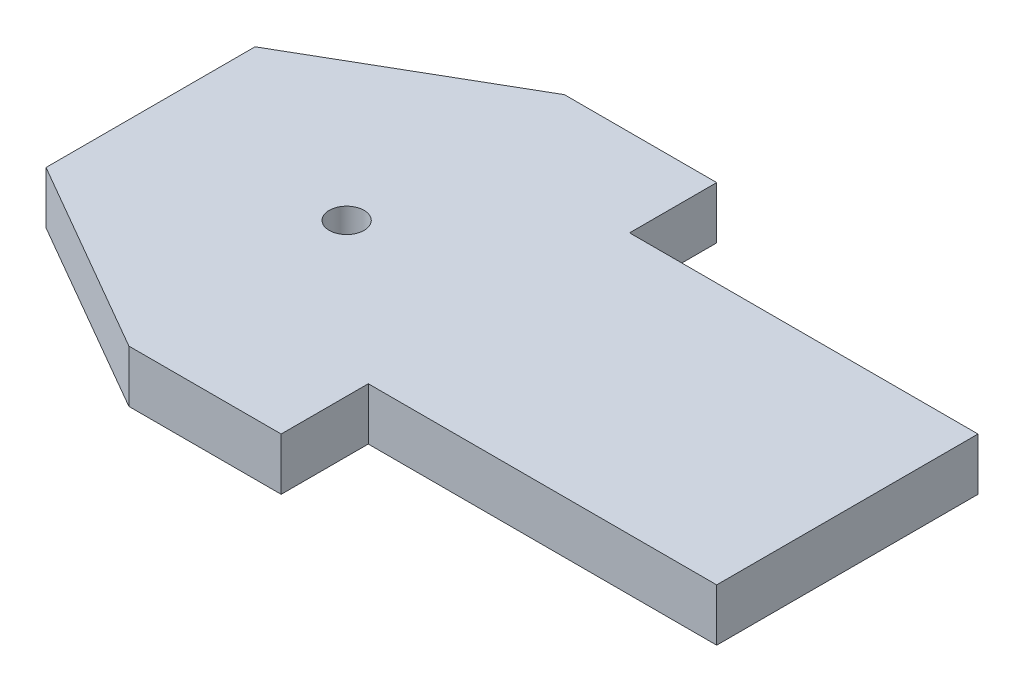
ISO-10303-21;
HEADER;
FILE_DESCRIPTION(('STEP AP214'),'2;1');
FILE_NAME('part.step','',(''),(''),'','','');
FILE_SCHEMA(('AUTOMOTIVE_DESIGN { 1 0 10303 214 1 1 1 1 }'));
ENDSEC;
DATA;
#1=APPLICATION_CONTEXT('core data for automotive mechanical design processes');
#2=APPLICATION_PROTOCOL_DEFINITION('international standard','automotive_design',2000,#1);
#3=PRODUCT_CONTEXT('',#1,'mechanical');
#4=PRODUCT('Part','Part','',(#3));
#5=PRODUCT_RELATED_PRODUCT_CATEGORY('part','',(#4));
#6=PRODUCT_DEFINITION_FORMATION('','',#4);
#7=PRODUCT_DEFINITION_CONTEXT('part definition',#1,'design');
#8=PRODUCT_DEFINITION('design','',#6,#7);
#9=PRODUCT_DEFINITION_SHAPE('','',#8);
#10=(LENGTH_UNIT() NAMED_UNIT(*) SI_UNIT(.MILLI.,.METRE.));
#11=(NAMED_UNIT(*) PLANE_ANGLE_UNIT() SI_UNIT($,.RADIAN.));
#12=(NAMED_UNIT(*) SI_UNIT($,.STERADIAN.) SOLID_ANGLE_UNIT());
#13=UNCERTAINTY_MEASURE_WITH_UNIT(LENGTH_MEASURE(1.E-05),#10,'distance_accuracy_value','');
#14=(GEOMETRIC_REPRESENTATION_CONTEXT(3) GLOBAL_UNCERTAINTY_ASSIGNED_CONTEXT((#13)) GLOBAL_UNIT_ASSIGNED_CONTEXT((#10,
#11,#12)) REPRESENTATION_CONTEXT('',''));
#15=CARTESIAN_POINT('',(0.,0.,0.));
#16=DIRECTION('',(0.,0.,1.));
#17=DIRECTION('',(1.,0.,0.));
#18=AXIS2_PLACEMENT_3D('',#15,#16,#17);
#19=CARTESIAN_POINT('',(10.0000000000004,3.,-7.50000000000014));
#20=DIRECTION('',(-1.,0.,0.));
#21=DIRECTION('',(0.,0.,1.));
#22=AXIS2_PLACEMENT_3D('',#19,#20,#21);
#23=PLANE('',#22);
#24=DIRECTION('',(0.,0.,-1.));
#25=VECTOR('',#24,1.);
#26=CARTESIAN_POINT('',(10.0000000000004,0.,-7.50000000000014));
#27=LINE('',#26,#25);
#28=CARTESIAN_POINT('',(10.,0.,7.5));
#29=VERTEX_POINT('',#28);
#30=CARTESIAN_POINT('',(10.0000000000004,0.,-7.50000000000014));
#31=VERTEX_POINT('',#30);
#32=EDGE_CURVE('E146',#29,#31,#27,.T.);
#33=ORIENTED_EDGE('',*,*,#32,.T.);
#34=DIRECTION('',(0.,-1.,0.));
#35=VECTOR('',#34,1.);
#36=CARTESIAN_POINT('',(10.0000000000004,3.,-7.50000000000014));
#37=LINE('',#36,#35);
#38=CARTESIAN_POINT('',(10.0000000000004,3.,-7.50000000000014));
#39=VERTEX_POINT('',#38);
#40=EDGE_CURVE('E11',#39,#31,#37,.T.);
#41=ORIENTED_EDGE('',*,*,#40,.F.);
#42=DIRECTION('',(0.,0.,-1.));
#43=VECTOR('',#42,1.);
#44=CARTESIAN_POINT('',(10.0000000000004,3.,-7.50000000000014));
#45=LINE('',#44,#43);
#46=CARTESIAN_POINT('',(10.,3.,7.5));
#47=VERTEX_POINT('',#46);
#48=EDGE_CURVE('E164',#47,#39,#45,.T.);
#49=ORIENTED_EDGE('',*,*,#48,.F.);
#50=DIRECTION('',(0.,-1.,0.));
#51=VECTOR('',#50,1.);
#52=CARTESIAN_POINT('',(10.,3.,7.5));
#53=LINE('',#52,#51);
#54=EDGE_CURVE('E142',#47,#29,#53,.T.);
#55=ORIENTED_EDGE('',*,*,#54,.T.);
#56=EDGE_LOOP('',(#33,#41,#49,#55));
#57=FACE_BOUND('',#56,.T.);
#58=ADVANCED_FACE('F37',(#57),#23,.F.);
#59=CARTESIAN_POINT('',(-10.0000000000007,3.,-7.50000000000014));
#60=DIRECTION('',(0.,0.,1.));
#61=DIRECTION('',(1.,0.,0.));
#62=AXIS2_PLACEMENT_3D('',#59,#60,#61);
#63=PLANE('',#62);
#64=DIRECTION('',(-1.,0.,0.));
#65=VECTOR('',#64,1.);
#66=CARTESIAN_POINT('',(-10.0000000000007,0.,-7.50000000000014));
#67=LINE('',#66,#65);
#68=CARTESIAN_POINT('',(-10.0000000000007,0.,-7.50000000000014));
#69=VERTEX_POINT('',#68);
#70=EDGE_CURVE('E149',#31,#69,#67,.T.);
#71=ORIENTED_EDGE('',*,*,#70,.T.);
#72=DIRECTION('',(0.,-1.,0.));
#73=VECTOR('',#72,1.);
#74=CARTESIAN_POINT('',(-10.0000000000007,3.,-7.50000000000014));
#75=LINE('',#74,#73);
#76=CARTESIAN_POINT('',(-10.0000000000007,3.,-7.50000000000014));
#77=VERTEX_POINT('',#76);
#78=EDGE_CURVE('E46',#77,#69,#75,.T.);
#79=ORIENTED_EDGE('',*,*,#78,.F.);
#80=DIRECTION('',(-1.,0.,0.));
#81=VECTOR('',#80,1.);
#82=CARTESIAN_POINT('',(-10.0000000000007,3.,-7.50000000000014));
#83=LINE('',#82,#81);
#84=EDGE_CURVE('E103',#39,#77,#83,.T.);
#85=ORIENTED_EDGE('',*,*,#84,.F.);
#86=ORIENTED_EDGE('',*,*,#40,.T.);
#87=EDGE_LOOP('',(#71,#79,#85,#86));
#88=FACE_BOUND('',#87,.T.);
#89=ADVANCED_FACE('F229',(#88),#63,.F.);
#90=CARTESIAN_POINT('',(-10.0000000000007,3.,-7.50000000000014));
#91=DIRECTION('',(-1.,0.,0.));
#92=DIRECTION('',(0.,0.,1.));
#93=AXIS2_PLACEMENT_3D('',#90,#91,#92);
#94=PLANE('',#93);
#95=DIRECTION('',(0.,0.,-1.));
#96=VECTOR('',#95,1.);
#97=CARTESIAN_POINT('',(-10.0000000000007,0.,-7.50000000000014));
#98=LINE('',#97,#96);
#99=CARTESIAN_POINT('',(-10.0000000000007,0.,-12.5000000000001));
#100=VERTEX_POINT('',#99);
#101=EDGE_CURVE('E151',#69,#100,#98,.T.);
#102=ORIENTED_EDGE('',*,*,#101,.T.);
#103=DIRECTION('',(0.,-1.,0.));
#104=VECTOR('',#103,1.);
#105=CARTESIAN_POINT('',(-10.0000000000007,3.,-12.5000000000001));
#106=LINE('',#105,#104);
#107=CARTESIAN_POINT('',(-10.0000000000007,3.,-12.5000000000001));
#108=VERTEX_POINT('',#107);
#109=EDGE_CURVE('E177',#108,#100,#106,.T.);
#110=ORIENTED_EDGE('',*,*,#109,.F.);
#111=DIRECTION('',(0.,0.,-1.));
#112=VECTOR('',#111,1.);
#113=CARTESIAN_POINT('',(-10.0000000000007,3.,-7.50000000000014));
#114=LINE('',#113,#112);
#115=EDGE_CURVE('E186',#77,#108,#114,.T.);
#116=ORIENTED_EDGE('',*,*,#115,.F.);
#117=ORIENTED_EDGE('',*,*,#78,.T.);
#118=EDGE_LOOP('',(#102,#110,#116,#117));
#119=FACE_BOUND('',#118,.T.);
#120=ADVANCED_FACE('F184',(#119),#94,.F.);
#121=CARTESIAN_POINT('',(-10.0000000000007,3.,-12.5000000000001));
#122=DIRECTION('',(0.,0.,1.));
#123=DIRECTION('',(1.,0.,0.));
#124=AXIS2_PLACEMENT_3D('',#121,#122,#123);
#125=PLANE('',#124);
#126=DIRECTION('',(-1.,0.,0.));
#127=VECTOR('',#126,1.);
#128=CARTESIAN_POINT('',(-10.0000000000007,0.,-12.5000000000001));
#129=LINE('',#128,#127);
#130=CARTESIAN_POINT('',(-18.7416697508023,0.,-12.5000000000001));
#131=VERTEX_POINT('',#130);
#132=EDGE_CURVE('E153',#100,#131,#129,.T.);
#133=ORIENTED_EDGE('',*,*,#132,.T.);
#134=DIRECTION('',(0.,-1.,0.));
#135=VECTOR('',#134,1.);
#136=CARTESIAN_POINT('',(-18.7416697508023,3.,-12.5000000000001));
#137=LINE('',#136,#135);
#138=CARTESIAN_POINT('',(-18.7416697508023,3.,-12.5000000000001));
#139=VERTEX_POINT('',#138);
#140=EDGE_CURVE('E174',#139,#131,#137,.T.);
#141=ORIENTED_EDGE('',*,*,#140,.F.);
#142=DIRECTION('',(-1.,0.,0.));
#143=VECTOR('',#142,1.);
#144=CARTESIAN_POINT('',(-10.0000000000007,3.,-12.5000000000001));
#145=LINE('',#144,#143);
#146=EDGE_CURVE('E204',#108,#139,#145,.T.);
#147=ORIENTED_EDGE('',*,*,#146,.F.);
#148=ORIENTED_EDGE('',*,*,#109,.T.);
#149=EDGE_LOOP('',(#133,#141,#147,#148));
#150=FACE_BOUND('',#149,.T.);
#151=ADVANCED_FACE('F195',(#150),#125,.F.);
#152=CARTESIAN_POINT('',(-30.0000000000001,3.,-6.0000000000002));
#153=DIRECTION('',(0.499999999999995,0.,0.866025403784441));
#154=DIRECTION('',(0.866025403784442,0.,-0.499999999999995));
#155=AXIS2_PLACEMENT_3D('',#152,#153,#154);
#156=PLANE('',#155);
#157=DIRECTION('',(-0.866025403784442,0.,0.499999999999995));
#158=VECTOR('',#157,1.);
#159=CARTESIAN_POINT('',(-30.0000000000001,0.,-6.0000000000002));
#160=LINE('',#159,#158);
#161=CARTESIAN_POINT('',(-30.0000000000001,0.,-6.0000000000002));
#162=VERTEX_POINT('',#161);
#163=EDGE_CURVE('E155',#131,#162,#160,.T.);
#164=ORIENTED_EDGE('',*,*,#163,.T.);
#165=DIRECTION('',(0.,-1.,0.));
#166=VECTOR('',#165,1.);
#167=CARTESIAN_POINT('',(-30.0000000000001,3.,-6.0000000000002));
#168=LINE('',#167,#166);
#169=CARTESIAN_POINT('',(-30.0000000000001,3.,-6.0000000000002));
#170=VERTEX_POINT('',#169);
#171=EDGE_CURVE('E171',#170,#162,#168,.T.);
#172=ORIENTED_EDGE('',*,*,#171,.F.);
#173=DIRECTION('',(-0.866025403784442,0.,0.499999999999995));
#174=VECTOR('',#173,1.);
#175=CARTESIAN_POINT('',(-30.0000000000001,3.,-6.0000000000002));
#176=LINE('',#175,#174);
#177=EDGE_CURVE('E201',#139,#170,#176,.T.);
#178=ORIENTED_EDGE('',*,*,#177,.F.);
#179=ORIENTED_EDGE('',*,*,#140,.T.);
#180=EDGE_LOOP('',(#164,#172,#178,#179));
#181=FACE_BOUND('',#180,.T.);
#182=ADVANCED_FACE('F199',(#181),#156,.F.);
#183=CARTESIAN_POINT('',(-30.0000000000001,3.,-6.0000000000002));
#184=DIRECTION('',(1.,0.,0.));
#185=DIRECTION('',(0.,0.,-1.));
#186=AXIS2_PLACEMENT_3D('',#183,#184,#185);
#187=PLANE('',#186);
#188=DIRECTION('',(0.,0.,1.));
#189=VECTOR('',#188,1.);
#190=CARTESIAN_POINT('',(-30.0000000000001,0.,-6.0000000000002));
#191=LINE('',#190,#189);
#192=CARTESIAN_POINT('',(-30.0000000000001,0.,5.9999999999998));
#193=VERTEX_POINT('',#192);
#194=EDGE_CURVE('E157',#162,#193,#191,.T.);
#195=ORIENTED_EDGE('',*,*,#194,.T.);
#196=DIRECTION('',(0.,-1.,0.));
#197=VECTOR('',#196,1.);
#198=CARTESIAN_POINT('',(-30.0000000000001,3.,5.9999999999998));
#199=LINE('',#198,#197);
#200=CARTESIAN_POINT('',(-30.0000000000001,3.,5.9999999999998));
#201=VERTEX_POINT('',#200);
#202=EDGE_CURVE('E168',#201,#193,#199,.T.);
#203=ORIENTED_EDGE('',*,*,#202,.F.);
#204=DIRECTION('',(0.,0.,1.));
#205=VECTOR('',#204,1.);
#206=CARTESIAN_POINT('',(-30.0000000000001,3.,-6.0000000000002));
#207=LINE('',#206,#205);
#208=EDGE_CURVE('E203',#170,#201,#207,.T.);
#209=ORIENTED_EDGE('',*,*,#208,.F.);
#210=ORIENTED_EDGE('',*,*,#171,.T.);
#211=EDGE_LOOP('',(#195,#203,#209,#210));
#212=FACE_BOUND('',#211,.T.);
#213=ADVANCED_FACE('F241',(#212),#187,.F.);
#214=CARTESIAN_POINT('',(-30.0000000000001,3.,5.9999999999998));
#215=DIRECTION('',(0.499999999999995,0.,-0.866025403784442));
#216=DIRECTION('',(-0.866025403784442,0.,-0.499999999999995));
#217=AXIS2_PLACEMENT_3D('',#214,#215,#216);
#218=PLANE('',#217);
#219=DIRECTION('',(0.866025403784442,0.,0.499999999999995));
#220=VECTOR('',#219,1.);
#221=CARTESIAN_POINT('',(-30.0000000000001,0.,5.9999999999998));
#222=LINE('',#221,#220);
#223=CARTESIAN_POINT('',(-18.7416697508021,0.,12.4999999999999));
#224=VERTEX_POINT('',#223);
#225=EDGE_CURVE('E159',#193,#224,#222,.T.);
#226=ORIENTED_EDGE('',*,*,#225,.T.);
#227=DIRECTION('',(0.,-1.,0.));
#228=VECTOR('',#227,1.);
#229=CARTESIAN_POINT('',(-18.7416697508021,3.,12.4999999999999));
#230=LINE('',#229,#228);
#231=CARTESIAN_POINT('',(-18.7416697508021,3.,12.4999999999999));
#232=VERTEX_POINT('',#231);
#233=EDGE_CURVE('E137',#232,#224,#230,.T.);
#234=ORIENTED_EDGE('',*,*,#233,.F.);
#235=DIRECTION('',(0.866025403784442,0.,0.499999999999995));
#236=VECTOR('',#235,1.);
#237=CARTESIAN_POINT('',(-30.0000000000001,3.,5.9999999999998));
#238=LINE('',#237,#236);
#239=EDGE_CURVE('E128',#201,#232,#238,.T.);
#240=ORIENTED_EDGE('',*,*,#239,.F.);
#241=ORIENTED_EDGE('',*,*,#202,.T.);
#242=EDGE_LOOP('',(#226,#234,#240,#241));
#243=FACE_BOUND('',#242,.T.);
#244=ADVANCED_FACE('F238',(#243),#218,.F.);
#245=CARTESIAN_POINT('',(-18.7416697508021,3.,12.4999999999999));
#246=DIRECTION('',(0.,0.,-1.));
#247=DIRECTION('',(-1.,0.,0.));
#248=AXIS2_PLACEMENT_3D('',#245,#246,#247);
#249=PLANE('',#248);
#250=DIRECTION('',(1.,0.,0.));
#251=VECTOR('',#250,1.);
#252=CARTESIAN_POINT('',(-18.7416697508021,0.,12.4999999999999));
#253=LINE('',#252,#251);
#254=CARTESIAN_POINT('',(-9.99999999999999,0.,12.5));
#255=VERTEX_POINT('',#254);
#256=EDGE_CURVE('E136',#224,#255,#253,.T.);
#257=ORIENTED_EDGE('',*,*,#256,.T.);
#258=DIRECTION('',(0.,-1.,0.));
#259=VECTOR('',#258,1.);
#260=CARTESIAN_POINT('',(-9.99999999999999,3.,12.5));
#261=LINE('',#260,#259);
#262=CARTESIAN_POINT('',(-9.99999999999999,3.,12.5));
#263=VERTEX_POINT('',#262);
#264=EDGE_CURVE('E133',#263,#255,#261,.T.);
#265=ORIENTED_EDGE('',*,*,#264,.F.);
#266=DIRECTION('',(1.,0.,0.));
#267=VECTOR('',#266,1.);
#268=CARTESIAN_POINT('',(-18.7416697508021,3.,12.4999999999999));
#269=LINE('',#268,#267);
#270=EDGE_CURVE('E122',#232,#263,#269,.T.);
#271=ORIENTED_EDGE('',*,*,#270,.F.);
#272=ORIENTED_EDGE('',*,*,#233,.T.);
#273=EDGE_LOOP('',(#257,#265,#271,#272));
#274=FACE_BOUND('',#273,.T.);
#275=ADVANCED_FACE('F134',(#274),#249,.F.);
#276=CARTESIAN_POINT('',(-9.99999999999999,3.,12.5));
#277=DIRECTION('',(-1.,0.,0.));
#278=DIRECTION('',(0.,0.,1.));
#279=AXIS2_PLACEMENT_3D('',#276,#277,#278);
#280=PLANE('',#279);
#281=DIRECTION('',(0.,0.,-1.));
#282=VECTOR('',#281,1.);
#283=CARTESIAN_POINT('',(-9.99999999999999,0.,12.5));
#284=LINE('',#283,#282);
#285=CARTESIAN_POINT('',(-9.99999999999999,0.,7.5));
#286=VERTEX_POINT('',#285);
#287=EDGE_CURVE('E89',#255,#286,#284,.T.);
#288=ORIENTED_EDGE('',*,*,#287,.T.);
#289=DIRECTION('',(0.,-1.,0.));
#290=VECTOR('',#289,1.);
#291=CARTESIAN_POINT('',(-9.99999999999999,3.,7.5));
#292=LINE('',#291,#290);
#293=CARTESIAN_POINT('',(-9.99999999999999,3.,7.5));
#294=VERTEX_POINT('',#293);
#295=EDGE_CURVE('E138',#294,#286,#292,.T.);
#296=ORIENTED_EDGE('',*,*,#295,.F.);
#297=DIRECTION('',(0.,0.,-1.));
#298=VECTOR('',#297,1.);
#299=CARTESIAN_POINT('',(-9.99999999999999,3.,12.5));
#300=LINE('',#299,#298);
#301=EDGE_CURVE('E126',#263,#294,#300,.T.);
#302=ORIENTED_EDGE('',*,*,#301,.F.);
#303=ORIENTED_EDGE('',*,*,#264,.T.);
#304=EDGE_LOOP('',(#288,#296,#302,#303));
#305=FACE_BOUND('',#304,.T.);
#306=ADVANCED_FACE('F140',(#305),#280,.F.);
#307=CARTESIAN_POINT('',(-9.99999999999999,3.,7.5));
#308=DIRECTION('',(0.,0.,-1.));
#309=DIRECTION('',(-1.,0.,0.));
#310=AXIS2_PLACEMENT_3D('',#307,#308,#309);
#311=PLANE('',#310);
#312=DIRECTION('',(1.,0.,0.));
#313=VECTOR('',#312,1.);
#314=CARTESIAN_POINT('',(-9.99999999999999,0.,7.5));
#315=LINE('',#314,#313);
#316=EDGE_CURVE('E95',#286,#29,#315,.T.);
#317=ORIENTED_EDGE('',*,*,#316,.T.);
#318=ORIENTED_EDGE('',*,*,#54,.F.);
#319=DIRECTION('',(1.,0.,0.));
#320=VECTOR('',#319,1.);
#321=CARTESIAN_POINT('',(-9.99999999999999,3.,7.5));
#322=LINE('',#321,#320);
#323=EDGE_CURVE('E54',#294,#47,#322,.T.);
#324=ORIENTED_EDGE('',*,*,#323,.F.);
#325=ORIENTED_EDGE('',*,*,#295,.T.);
#326=EDGE_LOOP('',(#317,#318,#324,#325));
#327=FACE_BOUND('',#326,.T.);
#328=ADVANCED_FACE('F293',(#327),#311,.F.);
#329=CARTESIAN_POINT('',(0.,3.,0.));
#330=DIRECTION('',(0.,1.,0.));
#331=DIRECTION('',(0.,0.,1.));
#332=AXIS2_PLACEMENT_3D('',#329,#330,#331);
#333=PLANE('',#332);
#334=CARTESIAN_POINT('',(-18.7416697508023,3.,0.));
#335=DIRECTION('',(0.,1.,0.));
#336=DIRECTION('',(0.,0.,1.));
#337=AXIS2_PLACEMENT_3D('',#334,#335,#336);
#338=CIRCLE('',#337,1.);
#339=CARTESIAN_POINT('',(-18.7416697508023,3.,1.));
#340=VERTEX_POINT('',#339);
#341=EDGE_CURVE('E212',#340,#340,#338,.T.);
#342=ORIENTED_EDGE('',*,*,#341,.F.);
#343=EDGE_LOOP('',(#342));
#344=FACE_BOUND('',#343,.T.);
#345=ORIENTED_EDGE('',*,*,#48,.T.);
#346=ORIENTED_EDGE('',*,*,#84,.T.);
#347=ORIENTED_EDGE('',*,*,#115,.T.);
#348=ORIENTED_EDGE('',*,*,#146,.T.);
#349=ORIENTED_EDGE('',*,*,#177,.T.);
#350=ORIENTED_EDGE('',*,*,#208,.T.);
#351=ORIENTED_EDGE('',*,*,#239,.T.);
#352=ORIENTED_EDGE('',*,*,#270,.T.);
#353=ORIENTED_EDGE('',*,*,#301,.T.);
#354=ORIENTED_EDGE('',*,*,#323,.T.);
#355=EDGE_LOOP('',(#345,#346,#347,#348,#349,#350,#351,#352,#353,#354));
#356=FACE_BOUND('',#355,.T.);
#357=ADVANCED_FACE('F124',(#344,#356),#333,.T.);
#358=CARTESIAN_POINT('',(0.,0.,0.));
#359=DIRECTION('',(0.,1.,0.));
#360=DIRECTION('',(0.,0.,1.));
#361=AXIS2_PLACEMENT_3D('',#358,#359,#360);
#362=PLANE('',#361);
#363=CARTESIAN_POINT('',(-18.7416697508023,0.,0.));
#364=DIRECTION('',(0.,1.,0.));
#365=DIRECTION('',(0.,0.,1.));
#366=AXIS2_PLACEMENT_3D('',#363,#364,#365);
#367=CIRCLE('',#366,1.);
#368=CARTESIAN_POINT('',(-18.7416697508023,0.,1.));
#369=VERTEX_POINT('',#368);
#370=EDGE_CURVE('E40',#369,#369,#367,.T.);
#371=ORIENTED_EDGE('',*,*,#370,.T.);
#372=EDGE_LOOP('',(#371));
#373=FACE_BOUND('',#372,.T.);
#374=ORIENTED_EDGE('',*,*,#32,.F.);
#375=ORIENTED_EDGE('',*,*,#316,.F.);
#376=ORIENTED_EDGE('',*,*,#287,.F.);
#377=ORIENTED_EDGE('',*,*,#256,.F.);
#378=ORIENTED_EDGE('',*,*,#225,.F.);
#379=ORIENTED_EDGE('',*,*,#194,.F.);
#380=ORIENTED_EDGE('',*,*,#163,.F.);
#381=ORIENTED_EDGE('',*,*,#132,.F.);
#382=ORIENTED_EDGE('',*,*,#101,.F.);
#383=ORIENTED_EDGE('',*,*,#70,.F.);
#384=EDGE_LOOP('',(#374,#375,#376,#377,#378,#379,#380,#381,#382,#383));
#385=FACE_BOUND('',#384,.T.);
#386=ADVANCED_FACE('F190',(#373,#385),#362,.F.);
#387=CARTESIAN_POINT('',(-18.7416697508023,-30.,0.));
#388=DIRECTION('',(0.,1.,0.));
#389=DIRECTION('',(0.,0.,1.));
#390=AXIS2_PLACEMENT_3D('',#387,#388,#389);
#391=CYLINDRICAL_SURFACE('',#390,1.);
#392=ORIENTED_EDGE('',*,*,#341,.T.);
#393=EDGE_LOOP('',(#392));
#394=FACE_BOUND('',#393,.T.);
#395=ORIENTED_EDGE('',*,*,#370,.F.);
#396=EDGE_LOOP('',(#395));
#397=FACE_BOUND('',#396,.T.);
#398=ADVANCED_FACE('F220',(#394,#397),#391,.F.);
#399=CLOSED_SHELL('',(#58,#89,#120,#151,#182,#213,#244,#275,#306,#328,#357,#386,#398));
#400=MANIFOLD_SOLID_BREP('B2',#399);
#401=ADVANCED_BREP_SHAPE_REPRESENTATION('',(#18,#400),#14);
#402=SHAPE_DEFINITION_REPRESENTATION(#9,#401);
ENDSEC;
END-ISO-10303-21;
